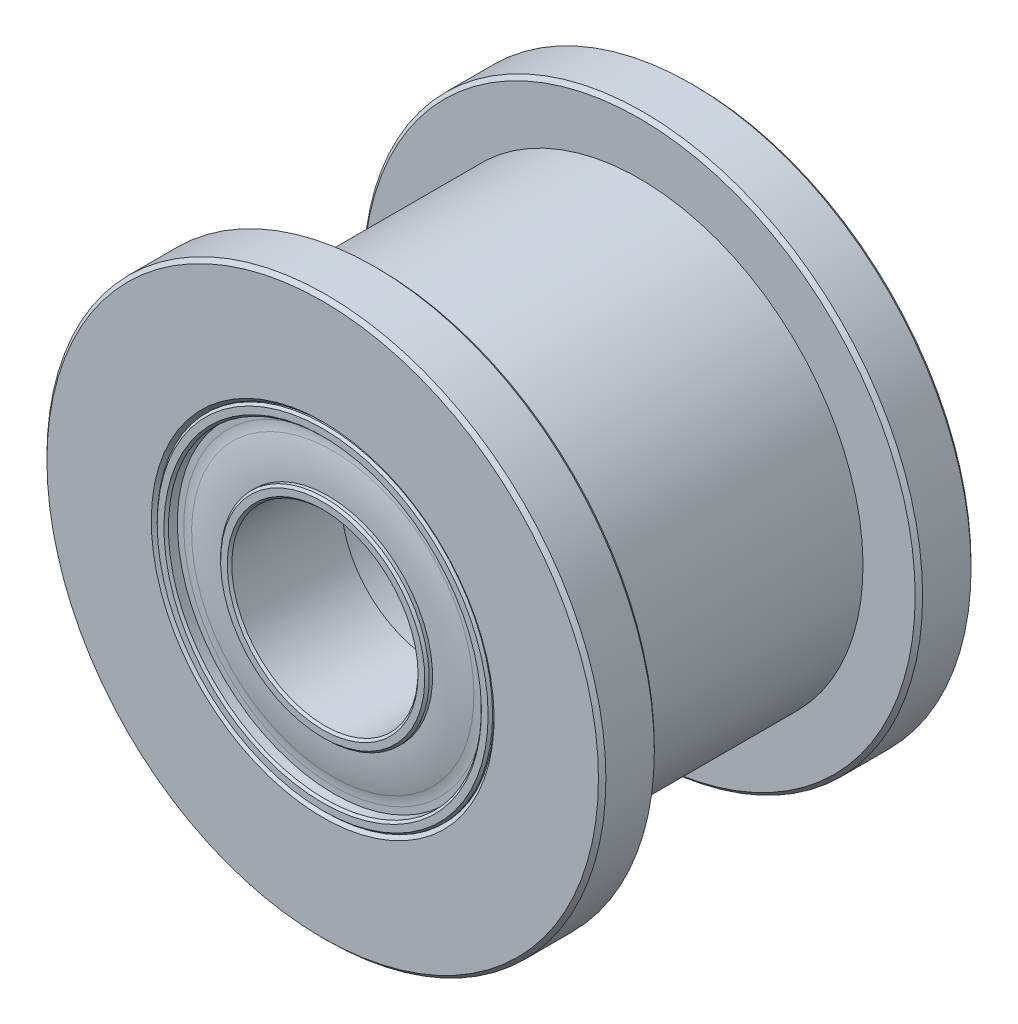
ISO-10303-21;
HEADER;
FILE_DESCRIPTION(('STEP AP214'),'2;1');
FILE_NAME('part.step','',(''),(''),'','','');
FILE_SCHEMA(('AUTOMOTIVE_DESIGN { 1 0 10303 214 1 1 1 1 }'));
ENDSEC;
DATA;
#1=APPLICATION_CONTEXT('core data for automotive mechanical design processes');
#2=APPLICATION_PROTOCOL_DEFINITION('international standard','automotive_design',2000,#1);
#3=PRODUCT_CONTEXT('',#1,'mechanical');
#4=PRODUCT('Part','Part','',(#3));
#5=PRODUCT_RELATED_PRODUCT_CATEGORY('part','',(#4));
#6=PRODUCT_DEFINITION_FORMATION('','',#4);
#7=PRODUCT_DEFINITION_CONTEXT('part definition',#1,'design');
#8=PRODUCT_DEFINITION('design','',#6,#7);
#9=PRODUCT_DEFINITION_SHAPE('','',#8);
#10=(LENGTH_UNIT() NAMED_UNIT(*) SI_UNIT(.MILLI.,.METRE.));
#11=(NAMED_UNIT(*) PLANE_ANGLE_UNIT() SI_UNIT($,.RADIAN.));
#12=(NAMED_UNIT(*) SI_UNIT($,.STERADIAN.) SOLID_ANGLE_UNIT());
#13=UNCERTAINTY_MEASURE_WITH_UNIT(LENGTH_MEASURE(1.E-05),#10,'distance_accuracy_value','');
#14=(GEOMETRIC_REPRESENTATION_CONTEXT(3) GLOBAL_UNCERTAINTY_ASSIGNED_CONTEXT((#13)) GLOBAL_UNIT_ASSIGNED_CONTEXT((#10,
#11,#12)) REPRESENTATION_CONTEXT('',''));
#15=CARTESIAN_POINT('',(0.,0.,0.));
#16=DIRECTION('',(0.,0.,1.));
#17=DIRECTION('',(1.,0.,0.));
#18=AXIS2_PLACEMENT_3D('',#15,#16,#17);
#19=CARTESIAN_POINT('',(0.,7.5,-3.5));
#20=DIRECTION('',(0.,0.,-1.));
#21=DIRECTION('',(0.,1.,0.));
#22=AXIS2_PLACEMENT_3D('',#19,#20,#21);
#23=PLANE('',#22);
#24=CARTESIAN_POINT('',(0.,0.,-3.5));
#25=DIRECTION('',(0.,0.,-1.));
#26=DIRECTION('',(0.,1.,0.));
#27=AXIS2_PLACEMENT_3D('',#24,#25,#26);
#28=CIRCLE('',#27,7.4);
#29=CARTESIAN_POINT('',(0.,7.4,-3.5));
#30=VERTEX_POINT('',#29);
#31=EDGE_CURVE('E70',#30,#30,#28,.F.);
#32=ORIENTED_EDGE('',*,*,#31,.T.);
#33=EDGE_LOOP('',(#32));
#34=FACE_BOUND('',#33,.T.);
#35=CARTESIAN_POINT('',(0.,0.,-3.5));
#36=DIRECTION('',(0.,0.,1.));
#37=DIRECTION('',(0.,-1.,0.));
#38=AXIS2_PLACEMENT_3D('',#35,#36,#37);
#39=CIRCLE('',#38,6.);
#40=CARTESIAN_POINT('',(0.,-6.,-3.5));
#41=VERTEX_POINT('',#40);
#42=EDGE_CURVE('E100',#41,#41,#39,.T.);
#43=ORIENTED_EDGE('',*,*,#42,.F.);
#44=EDGE_LOOP('',(#43));
#45=FACE_BOUND('',#44,.T.);
#46=ADVANCED_FACE('F41',(#34,#45),#23,.F.);
#47=CARTESIAN_POINT('',(0.,0.,5.));
#48=DIRECTION('',(0.,0.,1.));
#49=DIRECTION('',(0.,-1.,0.));
#50=AXIS2_PLACEMENT_3D('',#47,#48,#49);
#51=CYLINDRICAL_SURFACE('',#50,7.5);
#52=CARTESIAN_POINT('',(0.,0.,-4.9));
#53=DIRECTION('',(0.,0.,1.));
#54=DIRECTION('',(0.,-1.,0.));
#55=AXIS2_PLACEMENT_3D('',#52,#53,#54);
#56=CIRCLE('',#55,7.5);
#57=CARTESIAN_POINT('',(0.,-7.5,-4.9));
#58=VERTEX_POINT('',#57);
#59=EDGE_CURVE('E79',#58,#58,#56,.T.);
#60=ORIENTED_EDGE('',*,*,#59,.T.);
#61=EDGE_LOOP('',(#60));
#62=FACE_BOUND('',#61,.T.);
#63=CARTESIAN_POINT('',(0.,0.,-3.6));
#64=DIRECTION('',(0.,0.,-1.));
#65=DIRECTION('',(0.,1.,0.));
#66=AXIS2_PLACEMENT_3D('',#63,#64,#65);
#67=CIRCLE('',#66,7.5);
#68=CARTESIAN_POINT('',(0.,7.5,-3.6));
#69=VERTEX_POINT('',#68);
#70=EDGE_CURVE('E82',#69,#69,#67,.T.);
#71=ORIENTED_EDGE('',*,*,#70,.T.);
#72=EDGE_LOOP('',(#71));
#73=FACE_BOUND('',#72,.T.);
#74=ADVANCED_FACE('F107',(#62,#73),#51,.T.);
#75=CARTESIAN_POINT('',(0.,7.5,-5.));
#76=DIRECTION('',(0.,0.,1.));
#77=DIRECTION('',(0.,-1.,0.));
#78=AXIS2_PLACEMENT_3D('',#75,#76,#77);
#79=PLANE('',#78);
#80=CARTESIAN_POINT('',(0.,0.,-5.));
#81=DIRECTION('',(0.,0.,1.));
#82=DIRECTION('',(0.,-1.,0.));
#83=AXIS2_PLACEMENT_3D('',#80,#81,#82);
#84=CIRCLE('',#83,7.4);
#85=CARTESIAN_POINT('',(0.,-7.4,-5.));
#86=VERTEX_POINT('',#85);
#87=EDGE_CURVE('E73',#86,#86,#84,.F.);
#88=ORIENTED_EDGE('',*,*,#87,.T.);
#89=EDGE_LOOP('',(#88));
#90=FACE_BOUND('',#89,.T.);
#91=CARTESIAN_POINT('',(0.,0.,-5.));
#92=DIRECTION('',(0.,0.,1.));
#93=DIRECTION('',(0.,-1.,0.));
#94=AXIS2_PLACEMENT_3D('',#91,#92,#93);
#95=CIRCLE('',#94,4.6);
#96=CARTESIAN_POINT('',(0.,-4.6,-5.));
#97=VERTEX_POINT('',#96);
#98=EDGE_CURVE('E76',#97,#97,#95,.T.);
#99=ORIENTED_EDGE('',*,*,#98,.T.);
#100=EDGE_LOOP('',(#99));
#101=FACE_BOUND('',#100,.T.);
#102=ADVANCED_FACE('F113',(#90,#101),#79,.F.);
#103=CARTESIAN_POINT('',(0.,0.,5.));
#104=DIRECTION('',(0.,0.,1.));
#105=DIRECTION('',(0.,-1.,0.));
#106=AXIS2_PLACEMENT_3D('',#103,#104,#105);
#107=CYLINDRICAL_SURFACE('',#106,4.5);
#108=CARTESIAN_POINT('',(0.,0.,-4.9));
#109=DIRECTION('',(0.,0.,1.));
#110=DIRECTION('',(0.,-1.,0.));
#111=AXIS2_PLACEMENT_3D('',#108,#109,#110);
#112=CIRCLE('',#111,4.5);
#113=CARTESIAN_POINT('',(0.,-4.5,-4.9));
#114=VERTEX_POINT('',#113);
#115=EDGE_CURVE('E48',#114,#114,#112,.F.);
#116=ORIENTED_EDGE('',*,*,#115,.T.);
#117=EDGE_LOOP('',(#116));
#118=FACE_BOUND('',#117,.T.);
#119=CARTESIAN_POINT('',(0.,0.,-2.));
#120=DIRECTION('',(0.,0.,1.));
#121=DIRECTION('',(0.,-1.,0.));
#122=AXIS2_PLACEMENT_3D('',#119,#120,#121);
#123=CIRCLE('',#122,4.5);
#124=CARTESIAN_POINT('',(0.,-4.5,-2.));
#125=VERTEX_POINT('',#124);
#126=EDGE_CURVE('E85',#125,#125,#123,.T.);
#127=ORIENTED_EDGE('',*,*,#126,.T.);
#128=EDGE_LOOP('',(#127));
#129=FACE_BOUND('',#128,.T.);
#130=ADVANCED_FACE('F144',(#118,#129),#107,.F.);
#131=CARTESIAN_POINT('',(0.,3.5,-2.));
#132=DIRECTION('',(0.,0.,1.));
#133=DIRECTION('',(0.,-1.,0.));
#134=AXIS2_PLACEMENT_3D('',#131,#132,#133);
#135=PLANE('',#134);
#136=ORIENTED_EDGE('',*,*,#126,.F.);
#137=EDGE_LOOP('',(#136));
#138=FACE_BOUND('',#137,.T.);
#139=CARTESIAN_POINT('',(0.,0.,-2.));
#140=DIRECTION('',(0.,0.,1.));
#141=DIRECTION('',(0.,-1.,0.));
#142=AXIS2_PLACEMENT_3D('',#139,#140,#141);
#143=CIRCLE('',#142,3.5);
#144=CARTESIAN_POINT('',(0.,-3.5,-2.));
#145=VERTEX_POINT('',#144);
#146=EDGE_CURVE('E88',#145,#145,#143,.T.);
#147=ORIENTED_EDGE('',*,*,#146,.T.);
#148=EDGE_LOOP('',(#147));
#149=FACE_BOUND('',#148,.T.);
#150=ADVANCED_FACE('F149',(#138,#149),#135,.F.);
#151=CARTESIAN_POINT('',(0.,0.,5.));
#152=DIRECTION('',(0.,0.,1.));
#153=DIRECTION('',(0.,-1.,0.));
#154=AXIS2_PLACEMENT_3D('',#151,#152,#153);
#155=CYLINDRICAL_SURFACE('',#154,3.5);
#156=ORIENTED_EDGE('',*,*,#146,.F.);
#157=EDGE_LOOP('',(#156));
#158=FACE_BOUND('',#157,.T.);
#159=CARTESIAN_POINT('',(0.,0.,2.));
#160=DIRECTION('',(0.,0.,1.));
#161=DIRECTION('',(0.,-1.,0.));
#162=AXIS2_PLACEMENT_3D('',#159,#160,#161);
#163=CIRCLE('',#162,3.5);
#164=CARTESIAN_POINT('',(0.,-3.5,2.));
#165=VERTEX_POINT('',#164);
#166=EDGE_CURVE('E91',#165,#165,#163,.T.);
#167=ORIENTED_EDGE('',*,*,#166,.T.);
#168=EDGE_LOOP('',(#167));
#169=FACE_BOUND('',#168,.T.);
#170=ADVANCED_FACE('F154',(#158,#169),#155,.F.);
#171=CARTESIAN_POINT('',(0.,4.5,2.));
#172=DIRECTION('',(0.,0.,-1.));
#173=DIRECTION('',(0.,1.,0.));
#174=AXIS2_PLACEMENT_3D('',#171,#172,#173);
#175=PLANE('',#174);
#176=ORIENTED_EDGE('',*,*,#166,.F.);
#177=EDGE_LOOP('',(#176));
#178=FACE_BOUND('',#177,.T.);
#179=CARTESIAN_POINT('',(0.,0.,2.));
#180=DIRECTION('',(0.,0.,1.));
#181=DIRECTION('',(0.,-1.,0.));
#182=AXIS2_PLACEMENT_3D('',#179,#180,#181);
#183=CIRCLE('',#182,4.5);
#184=CARTESIAN_POINT('',(0.,-4.5,2.));
#185=VERTEX_POINT('',#184);
#186=EDGE_CURVE('E94',#185,#185,#183,.T.);
#187=ORIENTED_EDGE('',*,*,#186,.T.);
#188=EDGE_LOOP('',(#187));
#189=FACE_BOUND('',#188,.T.);
#190=ADVANCED_FACE('F158',(#178,#189),#175,.F.);
#191=CARTESIAN_POINT('',(0.,0.,5.));
#192=DIRECTION('',(0.,0.,1.));
#193=DIRECTION('',(0.,-1.,0.));
#194=AXIS2_PLACEMENT_3D('',#191,#192,#193);
#195=CYLINDRICAL_SURFACE('',#194,4.5);
#196=CARTESIAN_POINT('',(0.,0.,4.9));
#197=DIRECTION('',(0.,0.,-1.));
#198=DIRECTION('',(0.,1.,0.));
#199=AXIS2_PLACEMENT_3D('',#196,#197,#198);
#200=CIRCLE('',#199,4.5);
#201=CARTESIAN_POINT('',(0.,4.5,4.9));
#202=VERTEX_POINT('',#201);
#203=EDGE_CURVE('E11',#202,#202,#200,.F.);
#204=ORIENTED_EDGE('',*,*,#203,.T.);
#205=EDGE_LOOP('',(#204));
#206=FACE_BOUND('',#205,.T.);
#207=ORIENTED_EDGE('',*,*,#186,.F.);
#208=EDGE_LOOP('',(#207));
#209=FACE_BOUND('',#208,.T.);
#210=ADVANCED_FACE('F162',(#206,#209),#195,.F.);
#211=CARTESIAN_POINT('',(0.,7.5,5.));
#212=DIRECTION('',(0.,0.,-1.));
#213=DIRECTION('',(0.,1.,0.));
#214=AXIS2_PLACEMENT_3D('',#211,#212,#213);
#215=PLANE('',#214);
#216=CARTESIAN_POINT('',(0.,0.,5.));
#217=DIRECTION('',(0.,0.,-1.));
#218=DIRECTION('',(0.,1.,0.));
#219=AXIS2_PLACEMENT_3D('',#216,#217,#218);
#220=CIRCLE('',#219,7.4);
#221=CARTESIAN_POINT('',(0.,7.4,5.));
#222=VERTEX_POINT('',#221);
#223=EDGE_CURVE('E52',#222,#222,#220,.F.);
#224=ORIENTED_EDGE('',*,*,#223,.T.);
#225=EDGE_LOOP('',(#224));
#226=FACE_BOUND('',#225,.T.);
#227=CARTESIAN_POINT('',(0.,0.,5.));
#228=DIRECTION('',(0.,0.,-1.));
#229=DIRECTION('',(0.,1.,0.));
#230=AXIS2_PLACEMENT_3D('',#227,#228,#229);
#231=CIRCLE('',#230,4.6);
#232=CARTESIAN_POINT('',(0.,4.6,5.));
#233=VERTEX_POINT('',#232);
#234=EDGE_CURVE('E56',#233,#233,#231,.T.);
#235=ORIENTED_EDGE('',*,*,#234,.T.);
#236=EDGE_LOOP('',(#235));
#237=FACE_BOUND('',#236,.T.);
#238=ADVANCED_FACE('F166',(#226,#237),#215,.F.);
#239=CARTESIAN_POINT('',(0.,0.,5.));
#240=DIRECTION('',(0.,0.,1.));
#241=DIRECTION('',(0.,-1.,0.));
#242=AXIS2_PLACEMENT_3D('',#239,#240,#241);
#243=CYLINDRICAL_SURFACE('',#242,7.5);
#244=CARTESIAN_POINT('',(0.,0.,3.6));
#245=DIRECTION('',(0.,0.,1.));
#246=DIRECTION('',(0.,-1.,0.));
#247=AXIS2_PLACEMENT_3D('',#244,#245,#246);
#248=CIRCLE('',#247,7.5);
#249=CARTESIAN_POINT('',(0.,-7.5,3.6));
#250=VERTEX_POINT('',#249);
#251=EDGE_CURVE('E64',#250,#250,#248,.T.);
#252=ORIENTED_EDGE('',*,*,#251,.T.);
#253=EDGE_LOOP('',(#252));
#254=FACE_BOUND('',#253,.T.);
#255=CARTESIAN_POINT('',(0.,0.,4.9));
#256=DIRECTION('',(0.,0.,-1.));
#257=DIRECTION('',(0.,1.,0.));
#258=AXIS2_PLACEMENT_3D('',#255,#256,#257);
#259=CIRCLE('',#258,7.5);
#260=CARTESIAN_POINT('',(0.,7.5,4.9));
#261=VERTEX_POINT('',#260);
#262=EDGE_CURVE('E67',#261,#261,#259,.T.);
#263=ORIENTED_EDGE('',*,*,#262,.T.);
#264=EDGE_LOOP('',(#263));
#265=FACE_BOUND('',#264,.T.);
#266=ADVANCED_FACE('F169',(#254,#265),#243,.T.);
#267=CARTESIAN_POINT('',(0.,7.5,3.5));
#268=DIRECTION('',(0.,0.,1.));
#269=DIRECTION('',(0.,-1.,0.));
#270=AXIS2_PLACEMENT_3D('',#267,#268,#269);
#271=PLANE('',#270);
#272=CARTESIAN_POINT('',(0.,0.,3.5));
#273=DIRECTION('',(0.,0.,1.));
#274=DIRECTION('',(0.,-1.,0.));
#275=AXIS2_PLACEMENT_3D('',#272,#273,#274);
#276=CIRCLE('',#275,7.4);
#277=CARTESIAN_POINT('',(0.,-7.4,3.5));
#278=VERTEX_POINT('',#277);
#279=EDGE_CURVE('E61',#278,#278,#276,.F.);
#280=ORIENTED_EDGE('',*,*,#279,.T.);
#281=EDGE_LOOP('',(#280));
#282=FACE_BOUND('',#281,.T.);
#283=CARTESIAN_POINT('',(0.,0.,3.5));
#284=DIRECTION('',(0.,0.,1.));
#285=DIRECTION('',(0.,-1.,0.));
#286=AXIS2_PLACEMENT_3D('',#283,#284,#285);
#287=CIRCLE('',#286,6.);
#288=CARTESIAN_POINT('',(0.,-6.,3.5));
#289=VERTEX_POINT('',#288);
#290=EDGE_CURVE('E97',#289,#289,#287,.T.);
#291=ORIENTED_EDGE('',*,*,#290,.T.);
#292=EDGE_LOOP('',(#291));
#293=FACE_BOUND('',#292,.T.);
#294=ADVANCED_FACE('F173',(#282,#293),#271,.F.);
#295=CARTESIAN_POINT('',(0.,0.,5.));
#296=DIRECTION('',(0.,0.,1.));
#297=DIRECTION('',(0.,-1.,0.));
#298=AXIS2_PLACEMENT_3D('',#295,#296,#297);
#299=CYLINDRICAL_SURFACE('',#298,6.);
#300=ORIENTED_EDGE('',*,*,#290,.F.);
#301=EDGE_LOOP('',(#300));
#302=FACE_BOUND('',#301,.T.);
#303=ORIENTED_EDGE('',*,*,#42,.T.);
#304=EDGE_LOOP('',(#303));
#305=FACE_BOUND('',#304,.T.);
#306=ADVANCED_FACE('F104',(#302,#305),#299,.T.);
#307=CARTESIAN_POINT('',(0.,0.,-4.9));
#308=DIRECTION('',(0.,0.,1.));
#309=DIRECTION('',(0.,-1.,0.));
#310=AXIS2_PLACEMENT_3D('',#307,#308,#309);
#311=CONICAL_SURFACE('',#310,7.5,0.785398163397448);
#312=ORIENTED_EDGE('',*,*,#87,.F.);
#313=EDGE_LOOP('',(#312));
#314=FACE_BOUND('',#313,.T.);
#315=ORIENTED_EDGE('',*,*,#59,.F.);
#316=EDGE_LOOP('',(#315));
#317=FACE_BOUND('',#316,.T.);
#318=ADVANCED_FACE('F118',(#314,#317),#311,.T.);
#319=CARTESIAN_POINT('',(0.,0.,-3.5));
#320=DIRECTION('',(0.,0.,-1.));
#321=DIRECTION('',(0.,1.,0.));
#322=AXIS2_PLACEMENT_3D('',#319,#320,#321);
#323=CONICAL_SURFACE('',#322,7.4,0.785398163397457);
#324=ORIENTED_EDGE('',*,*,#70,.F.);
#325=EDGE_LOOP('',(#324));
#326=FACE_BOUND('',#325,.T.);
#327=ORIENTED_EDGE('',*,*,#31,.F.);
#328=EDGE_LOOP('',(#327));
#329=FACE_BOUND('',#328,.T.);
#330=ADVANCED_FACE('F121',(#326,#329),#323,.T.);
#331=CARTESIAN_POINT('',(0.,0.,3.6));
#332=DIRECTION('',(0.,0.,1.));
#333=DIRECTION('',(0.,-1.,0.));
#334=AXIS2_PLACEMENT_3D('',#331,#332,#333);
#335=CONICAL_SURFACE('',#334,7.5,0.785398163397453);
#336=ORIENTED_EDGE('',*,*,#279,.F.);
#337=EDGE_LOOP('',(#336));
#338=FACE_BOUND('',#337,.T.);
#339=ORIENTED_EDGE('',*,*,#251,.F.);
#340=EDGE_LOOP('',(#339));
#341=FACE_BOUND('',#340,.T.);
#342=ADVANCED_FACE('F125',(#338,#341),#335,.T.);
#343=CARTESIAN_POINT('',(0.,0.,5.));
#344=DIRECTION('',(0.,0.,-1.));
#345=DIRECTION('',(0.,1.,0.));
#346=AXIS2_PLACEMENT_3D('',#343,#344,#345);
#347=CONICAL_SURFACE('',#346,7.4,0.785398163397448);
#348=ORIENTED_EDGE('',*,*,#262,.F.);
#349=EDGE_LOOP('',(#348));
#350=FACE_BOUND('',#349,.T.);
#351=ORIENTED_EDGE('',*,*,#223,.F.);
#352=EDGE_LOOP('',(#351));
#353=FACE_BOUND('',#352,.T.);
#354=ADVANCED_FACE('F129',(#350,#353),#347,.T.);
#355=CARTESIAN_POINT('',(0.,0.,-5.));
#356=DIRECTION('',(0.,0.,-1.));
#357=DIRECTION('',(0.,1.,0.));
#358=AXIS2_PLACEMENT_3D('',#355,#356,#357);
#359=CONICAL_SURFACE('',#358,4.6,0.785398163397435);
#360=ORIENTED_EDGE('',*,*,#115,.F.);
#361=EDGE_LOOP('',(#360));
#362=FACE_BOUND('',#361,.T.);
#363=ORIENTED_EDGE('',*,*,#98,.F.);
#364=EDGE_LOOP('',(#363));
#365=FACE_BOUND('',#364,.T.);
#366=ADVANCED_FACE('F132',(#362,#365),#359,.F.);
#367=CARTESIAN_POINT('',(0.,0.,4.9));
#368=DIRECTION('',(0.,0.,1.));
#369=DIRECTION('',(0.,-1.,0.));
#370=AXIS2_PLACEMENT_3D('',#367,#368,#369);
#371=CONICAL_SURFACE('',#370,4.5,0.78539816339744);
#372=ORIENTED_EDGE('',*,*,#234,.F.);
#373=EDGE_LOOP('',(#372));
#374=FACE_BOUND('',#373,.T.);
#375=ORIENTED_EDGE('',*,*,#203,.F.);
#376=EDGE_LOOP('',(#375));
#377=FACE_BOUND('',#376,.T.);
#378=ADVANCED_FACE('F43',(#374,#377),#371,.F.);
#379=CLOSED_SHELL('',(#46,#74,#102,#130,#150,#170,#190,#210,#238,#266,#294,#306,#318,#330,#342,
#354,#366,#378));
#380=MANIFOLD_SOLID_BREP('B2',#379);
#381=CARTESIAN_POINT('',(0.,2.5,5.));
#382=DIRECTION('',(0.,0.,-1.));
#383=DIRECTION('',(0.,-1.,0.));
#384=AXIS2_PLACEMENT_3D('',#381,#382,#383);
#385=PLANE('',#384);
#386=CARTESIAN_POINT('',(0.,0.,5.));
#387=DIRECTION('',(0.,0.,1.));
#388=DIRECTION('',(0.,-1.,0.));
#389=AXIS2_PLACEMENT_3D('',#386,#387,#388);
#390=CIRCLE('',#389,2.74);
#391=CARTESIAN_POINT('',(0.,-2.74,5.));
#392=VERTEX_POINT('',#391);
#393=EDGE_CURVE('E348',#392,#392,#390,.F.);
#394=ORIENTED_EDGE('',*,*,#393,.F.);
#395=EDGE_LOOP('',(#394));
#396=FACE_BOUND('',#395,.T.);
#397=CARTESIAN_POINT('',(0.,0.,5.));
#398=DIRECTION('',(0.,0.,1.));
#399=DIRECTION('',(0.,-1.,0.));
#400=AXIS2_PLACEMENT_3D('',#397,#398,#399);
#401=CIRCLE('',#400,2.56);
#402=CARTESIAN_POINT('',(0.,-2.56,5.));
#403=VERTEX_POINT('',#402);
#404=EDGE_CURVE('E351',#403,#403,#401,.T.);
#405=ORIENTED_EDGE('',*,*,#404,.F.);
#406=EDGE_LOOP('',(#405));
#407=FACE_BOUND('',#406,.T.);
#408=ADVANCED_FACE('F319',(#396,#407),#385,.F.);
#409=CARTESIAN_POINT('',(0.,0.,-5.));
#410=DIRECTION('',(0.,0.,-1.));
#411=DIRECTION('',(0.,-1.,0.));
#412=AXIS2_PLACEMENT_3D('',#409,#410,#411);
#413=CYLINDRICAL_SURFACE('',#412,2.5);
#414=CARTESIAN_POINT('',(0.,0.,4.94));
#415=DIRECTION('',(0.,0.,1.));
#416=DIRECTION('',(0.,-1.,0.));
#417=AXIS2_PLACEMENT_3D('',#414,#415,#416);
#418=CIRCLE('',#417,2.5);
#419=CARTESIAN_POINT('',(0.,-2.5,4.94));
#420=VERTEX_POINT('',#419);
#421=EDGE_CURVE('E345',#420,#420,#418,.F.);
#422=ORIENTED_EDGE('',*,*,#421,.F.);
#423=EDGE_LOOP('',(#422));
#424=FACE_BOUND('',#423,.T.);
#425=CARTESIAN_POINT('',(0.,0.,2.));
#426=DIRECTION('',(0.,0.,1.));
#427=DIRECTION('',(0.,-1.,0.));
#428=AXIS2_PLACEMENT_3D('',#425,#426,#427);
#429=CIRCLE('',#428,2.5);
#430=CARTESIAN_POINT('',(0.,-2.5,2.));
#431=VERTEX_POINT('',#430);
#432=EDGE_CURVE('E357',#431,#431,#429,.T.);
#433=ORIENTED_EDGE('',*,*,#432,.F.);
#434=EDGE_LOOP('',(#433));
#435=FACE_BOUND('',#434,.T.);
#436=ADVANCED_FACE('F388',(#424,#435),#413,.F.);
#437=CARTESIAN_POINT('',(0.,4.5,2.));
#438=DIRECTION('',(0.,0.,1.));
#439=DIRECTION('',(0.,1.,0.));
#440=AXIS2_PLACEMENT_3D('',#437,#438,#439);
#441=PLANE('',#440);
#442=ORIENTED_EDGE('',*,*,#432,.T.);
#443=EDGE_LOOP('',(#442));
#444=FACE_BOUND('',#443,.T.);
#445=CARTESIAN_POINT('',(0.,0.,2.));
#446=DIRECTION('',(0.,0.,1.));
#447=DIRECTION('',(0.,-1.,0.));
#448=AXIS2_PLACEMENT_3D('',#445,#446,#447);
#449=CIRCLE('',#448,4.5);
#450=CARTESIAN_POINT('',(0.,-4.5,2.));
#451=VERTEX_POINT('',#450);
#452=EDGE_CURVE('E360',#451,#451,#449,.T.);
#453=ORIENTED_EDGE('',*,*,#452,.F.);
#454=EDGE_LOOP('',(#453));
#455=FACE_BOUND('',#454,.T.);
#456=ADVANCED_FACE('F394',(#444,#455),#441,.F.);
#457=CARTESIAN_POINT('',(0.,0.,-5.));
#458=DIRECTION('',(0.,0.,-1.));
#459=DIRECTION('',(0.,-1.,0.));
#460=AXIS2_PLACEMENT_3D('',#457,#458,#459);
#461=CYLINDRICAL_SURFACE('',#460,4.5);
#462=CARTESIAN_POINT('',(0.,0.,4.94));
#463=DIRECTION('',(0.,0.,1.));
#464=DIRECTION('',(0.,-1.,0.));
#465=AXIS2_PLACEMENT_3D('',#462,#463,#464);
#466=CIRCLE('',#465,4.5);
#467=CARTESIAN_POINT('',(0.,-4.5,4.94));
#468=VERTEX_POINT('',#467);
#469=EDGE_CURVE('E330',#468,#468,#466,.T.);
#470=ORIENTED_EDGE('',*,*,#469,.F.);
#471=EDGE_LOOP('',(#470));
#472=FACE_BOUND('',#471,.T.);
#473=ORIENTED_EDGE('',*,*,#452,.T.);
#474=EDGE_LOOP('',(#473));
#475=FACE_BOUND('',#474,.T.);
#476=ADVANCED_FACE('F421',(#472,#475),#461,.T.);
#477=CARTESIAN_POINT('',(0.,4.5,5.));
#478=DIRECTION('',(0.,0.,-1.));
#479=DIRECTION('',(0.,-1.,0.));
#480=AXIS2_PLACEMENT_3D('',#477,#478,#479);
#481=PLANE('',#480);
#482=CARTESIAN_POINT('',(0.,0.,5.));
#483=DIRECTION('',(0.,0.,1.));
#484=DIRECTION('',(0.,-1.,0.));
#485=AXIS2_PLACEMENT_3D('',#482,#483,#484);
#486=CIRCLE('',#485,4.26);
#487=CARTESIAN_POINT('',(0.,-4.26,5.));
#488=VERTEX_POINT('',#487);
#489=EDGE_CURVE('E339',#488,#488,#486,.T.);
#490=ORIENTED_EDGE('',*,*,#489,.F.);
#491=EDGE_LOOP('',(#490));
#492=FACE_BOUND('',#491,.T.);
#493=CARTESIAN_POINT('',(0.,0.,5.));
#494=DIRECTION('',(0.,0.,1.));
#495=DIRECTION('',(0.,-1.,0.));
#496=AXIS2_PLACEMENT_3D('',#493,#494,#495);
#497=CIRCLE('',#496,4.44);
#498=CARTESIAN_POINT('',(0.,-4.44,5.));
#499=VERTEX_POINT('',#498);
#500=EDGE_CURVE('E342',#499,#499,#497,.F.);
#501=ORIENTED_EDGE('',*,*,#500,.F.);
#502=EDGE_LOOP('',(#501));
#503=FACE_BOUND('',#502,.T.);
#504=ADVANCED_FACE('F424',(#492,#503),#481,.F.);
#505=CARTESIAN_POINT('',(0.,0.,-5.));
#506=DIRECTION('',(0.,0.,-1.));
#507=DIRECTION('',(0.,-1.,0.));
#508=AXIS2_PLACEMENT_3D('',#505,#506,#507);
#509=CYLINDRICAL_SURFACE('',#508,4.2);
#510=CARTESIAN_POINT('',(0.,0.,4.94));
#511=DIRECTION('',(0.,0.,1.));
#512=DIRECTION('',(0.,-1.,0.));
#513=AXIS2_PLACEMENT_3D('',#510,#511,#512);
#514=CIRCLE('',#513,4.2);
#515=CARTESIAN_POINT('',(0.,-4.2,4.94));
#516=VERTEX_POINT('',#515);
#517=EDGE_CURVE('E334',#516,#516,#514,.F.);
#518=ORIENTED_EDGE('',*,*,#517,.F.);
#519=EDGE_LOOP('',(#518));
#520=FACE_BOUND('',#519,.T.);
#521=CARTESIAN_POINT('',(0.,0.,4.7));
#522=DIRECTION('',(0.,0.,1.));
#523=DIRECTION('',(0.,-1.,0.));
#524=AXIS2_PLACEMENT_3D('',#521,#522,#523);
#525=CIRCLE('',#524,4.2);
#526=CARTESIAN_POINT('',(0.,-4.2,4.7));
#527=VERTEX_POINT('',#526);
#528=EDGE_CURVE('E363',#527,#527,#525,.T.);
#529=ORIENTED_EDGE('',*,*,#528,.F.);
#530=EDGE_LOOP('',(#529));
#531=FACE_BOUND('',#530,.T.);
#532=ADVANCED_FACE('F384',(#520,#531),#509,.F.);
#533=CARTESIAN_POINT('',(0.,3.9,4.7));
#534=DIRECTION('',(0.,0.,-1.));
#535=DIRECTION('',(0.,-1.,0.));
#536=AXIS2_PLACEMENT_3D('',#533,#534,#535);
#537=PLANE('',#536);
#538=CARTESIAN_POINT('',(0.,0.,4.7));
#539=DIRECTION('',(0.,0.,1.));
#540=DIRECTION('',(0.,-1.,0.));
#541=AXIS2_PLACEMENT_3D('',#538,#539,#540);
#542=CIRCLE('',#541,4.02882057274445);
#543=CARTESIAN_POINT('',(0.,-4.02882057274445,4.7));
#544=VERTEX_POINT('',#543);
#545=EDGE_CURVE('E326',#544,#544,#542,.T.);
#546=ORIENTED_EDGE('',*,*,#545,.F.);
#547=EDGE_LOOP('',(#546));
#548=FACE_BOUND('',#547,.T.);
#549=ORIENTED_EDGE('',*,*,#528,.T.);
#550=EDGE_LOOP('',(#549));
#551=FACE_BOUND('',#550,.T.);
#552=ADVANCED_FACE('F374',(#548,#551),#537,.F.);
#553=CARTESIAN_POINT('',(0.,0.,0.741666666666619));
#554=DIRECTION('',(0.,0.,-1.));
#555=DIRECTION('',(0.,-1.,0.));
#556=AXIS2_PLACEMENT_3D('',#553,#554,#555);
#557=DEGENERATE_TOROIDAL_SURFACE('',#556,2.8,4.10833333333338,.T.);
#558=CARTESIAN_POINT('',(0.,0.,4.72936378466557));
#559=DIRECTION('',(0.,0.,1.));
#560=DIRECTION('',(0.,-1.,0.));
#561=AXIS2_PLACEMENT_3D('',#558,#559,#560);
#562=CIRCLE('',#561,3.78826842147311);
#563=CARTESIAN_POINT('',(0.,-3.78826842147311,4.72936378466557));
#564=VERTEX_POINT('',#563);
#565=EDGE_CURVE('E40',#564,#564,#562,.F.);
#566=ORIENTED_EDGE('',*,*,#565,.F.);
#567=EDGE_LOOP('',(#566));
#568=FACE_BOUND('',#567,.T.);
#569=CARTESIAN_POINT('',(0.,0.,4.85));
#570=DIRECTION('',(0.,0.,1.));
#571=DIRECTION('',(0.,-1.,0.));
#572=AXIS2_PLACEMENT_3D('',#569,#570,#571);
#573=CIRCLE('',#572,2.8);
#574=CARTESIAN_POINT('',(0.,-2.8,4.85));
#575=VERTEX_POINT('',#574);
#576=EDGE_CURVE('E366',#575,#575,#573,.T.);
#577=ORIENTED_EDGE('',*,*,#576,.F.);
#578=EDGE_LOOP('',(#577));
#579=FACE_BOUND('',#578,.T.);
#580=ADVANCED_FACE('F372',(#568,#579),#557,.T.);
#581=CARTESIAN_POINT('',(0.,0.,-5.));
#582=DIRECTION('',(0.,0.,-1.));
#583=DIRECTION('',(0.,-1.,0.));
#584=AXIS2_PLACEMENT_3D('',#581,#582,#583);
#585=CYLINDRICAL_SURFACE('',#584,2.8);
#586=CARTESIAN_POINT('',(0.,0.,4.94));
#587=DIRECTION('',(0.,0.,1.));
#588=DIRECTION('',(0.,-1.,0.));
#589=AXIS2_PLACEMENT_3D('',#586,#587,#588);
#590=CIRCLE('',#589,2.8);
#591=CARTESIAN_POINT('',(0.,-2.8,4.94));
#592=VERTEX_POINT('',#591);
#593=EDGE_CURVE('E354',#592,#592,#590,.T.);
#594=ORIENTED_EDGE('',*,*,#593,.F.);
#595=EDGE_LOOP('',(#594));
#596=FACE_BOUND('',#595,.T.);
#597=ORIENTED_EDGE('',*,*,#576,.T.);
#598=EDGE_LOOP('',(#597));
#599=FACE_BOUND('',#598,.T.);
#600=ADVANCED_FACE('F370',(#596,#599),#585,.T.);
#601=CARTESIAN_POINT('',(0.,0.,4.94));
#602=DIRECTION('',(0.,0.,-1.));
#603=DIRECTION('',(0.,-1.,0.));
#604=AXIS2_PLACEMENT_3D('',#601,#602,#603);
#605=CONICAL_SURFACE('',#604,2.8,0.785398163397434);
#606=CARTESIAN_POINT('',(0.,-2.74,5.));
#607=CARTESIAN_POINT('',(0.,-2.740625,4.999375));
#608=CARTESIAN_POINT('',(0.,-2.74125,4.99875));
#609=CARTESIAN_POINT('',(0.,-2.7425,4.9975));
#610=CARTESIAN_POINT('',(0.,-2.743125,4.996875));
#611=CARTESIAN_POINT('',(0.,-2.744375,4.995625));
#612=CARTESIAN_POINT('',(0.,-2.745,4.995));
#613=CARTESIAN_POINT('',(0.,-2.74625,4.99375));
#614=CARTESIAN_POINT('',(0.,-2.746875,4.993125));
#615=CARTESIAN_POINT('',(0.,-2.748125,4.991875));
#616=CARTESIAN_POINT('',(0.,-2.74875,4.99125));
#617=CARTESIAN_POINT('',(0.,-2.75,4.99));
#618=CARTESIAN_POINT('',(0.,-2.750625,4.989375));
#619=CARTESIAN_POINT('',(0.,-2.751875,4.988125));
#620=CARTESIAN_POINT('',(0.,-2.7525,4.9875));
#621=CARTESIAN_POINT('',(0.,-2.75375,4.98625));
#622=CARTESIAN_POINT('',(0.,-2.754375,4.985625));
#623=CARTESIAN_POINT('',(0.,-2.755625,4.984375));
#624=CARTESIAN_POINT('',(0.,-2.75625,4.98375));
#625=CARTESIAN_POINT('',(0.,-2.7575,4.9825));
#626=CARTESIAN_POINT('',(0.,-2.758125,4.981875));
#627=CARTESIAN_POINT('',(0.,-2.759375,4.980625));
#628=CARTESIAN_POINT('',(0.,-2.76,4.98));
#629=CARTESIAN_POINT('',(0.,-2.76125,4.97875));
#630=CARTESIAN_POINT('',(0.,-2.761875,4.978125));
#631=CARTESIAN_POINT('',(0.,-2.763125,4.976875));
#632=CARTESIAN_POINT('',(0.,-2.76375,4.97625));
#633=CARTESIAN_POINT('',(0.,-2.765,4.975));
#634=CARTESIAN_POINT('',(0.,-2.765625,4.974375));
#635=CARTESIAN_POINT('',(0.,-2.766875,4.973125));
#636=CARTESIAN_POINT('',(0.,-2.7675,4.9725));
#637=CARTESIAN_POINT('',(0.,-2.76875,4.97125));
#638=CARTESIAN_POINT('',(0.,-2.769375,4.970625));
#639=CARTESIAN_POINT('',(0.,-2.770625,4.969375));
#640=CARTESIAN_POINT('',(0.,-2.77125,4.96875));
#641=CARTESIAN_POINT('',(0.,-2.7725,4.9675));
#642=CARTESIAN_POINT('',(0.,-2.773125,4.966875));
#643=CARTESIAN_POINT('',(0.,-2.774375,4.965625));
#644=CARTESIAN_POINT('',(0.,-2.775,4.965));
#645=CARTESIAN_POINT('',(0.,-2.77625,4.96375));
#646=CARTESIAN_POINT('',(0.,-2.776875,4.963125));
#647=CARTESIAN_POINT('',(0.,-2.778125,4.961875));
#648=CARTESIAN_POINT('',(0.,-2.77875,4.96125));
#649=CARTESIAN_POINT('',(0.,-2.78,4.96));
#650=CARTESIAN_POINT('',(0.,-2.780625,4.959375));
#651=CARTESIAN_POINT('',(0.,-2.781875,4.958125));
#652=CARTESIAN_POINT('',(0.,-2.7825,4.9575));
#653=CARTESIAN_POINT('',(0.,-2.78375,4.95625));
#654=CARTESIAN_POINT('',(0.,-2.784375,4.955625));
#655=CARTESIAN_POINT('',(0.,-2.785625,4.954375));
#656=CARTESIAN_POINT('',(0.,-2.78625,4.95375));
#657=CARTESIAN_POINT('',(0.,-2.7875,4.9525));
#658=CARTESIAN_POINT('',(0.,-2.788125,4.951875));
#659=CARTESIAN_POINT('',(0.,-2.789375,4.950625));
#660=CARTESIAN_POINT('',(0.,-2.79,4.95));
#661=CARTESIAN_POINT('',(0.,-2.79125,4.94875));
#662=CARTESIAN_POINT('',(0.,-2.791875,4.948125));
#663=CARTESIAN_POINT('',(0.,-2.793125,4.946875));
#664=CARTESIAN_POINT('',(0.,-2.79375,4.94625));
#665=CARTESIAN_POINT('',(0.,-2.795,4.945));
#666=CARTESIAN_POINT('',(0.,-2.795625,4.944375));
#667=CARTESIAN_POINT('',(0.,-2.796875,4.943125));
#668=CARTESIAN_POINT('',(0.,-2.7975,4.9425));
#669=CARTESIAN_POINT('',(0.,-2.79875,4.94125));
#670=CARTESIAN_POINT('',(0.,-2.799375,4.940625));
#671=CARTESIAN_POINT('',(0.,-2.8,4.94));
#672=B_SPLINE_CURVE_WITH_KNOTS('',3,(#606,#607,#608,#609,#610,#611,#612,#613,#614,#615,#616,
#617,#618,#619,#620,#621,#622,#623,#624,#625,#626,#627,#628,#629,#630,#631,#632,#633,#634,#635,
#636,#637,#638,#639,#640,#641,#642,#643,#644,#645,#646,#647,#648,#649,#650,#651,#652,#653,#654,
#655,#656,#657,#658,#659,#660,#661,#662,#663,#664,#665,#666,#667,#668,#669,#670,#671),
.UNSPECIFIED.,.F.,.F.,(4,2,2,2,2,2,2,2,2,2,2,2,2,2,2,2,2,2,2,2,2,2,2,2,2,2,2,2,2,2,2,2,4),(0.,
0.00265165042944975,0.0053033008588992,0.00795495128834895,0.0106066017177984,
0.0132582521472481,0.0159099025766979,0.0185615530061473,0.0212132034355965,0.0238648538650462,
0.0265165042944957,0.0291681547239454,0.0318198051533949,0.0344714555828446,0.0371231060122944,
0.0397747564417438,0.042426406871193,0.0450780573006427,0.0477297077300922,0.0503813581595419,
0.0530330085889914,0.0556846590184411,0.0583363094478909,0.0609879598773403,0.0636396103067901,
0.0662912607362392,0.0689429111656886,0.0715945615951384,0.0742462120245881,0.0768978624540376,
0.0795495128834873,0.0822011633129368,0.0848528137423859),.UNSPECIFIED.);
#673=EDGE_CURVE('BSEAM381',#392,#592,#672,.T.);
#674=ORIENTED_EDGE('',*,*,#393,.T.);
#675=ORIENTED_EDGE('',*,*,#593,.T.);
#676=ORIENTED_EDGE('',*,*,#673,.T.);
#677=ORIENTED_EDGE('',*,*,#673,.F.);
#678=EDGE_LOOP('',(#674,#676,#675,#677));
#679=FACE_BOUND('',#678,.T.);
#680=ADVANCED_FACE('F381',(#679),#605,.T.);
#681=CARTESIAN_POINT('',(0.,0.,5.));
#682=DIRECTION('',(0.,0.,1.));
#683=DIRECTION('',(0.,1.,0.));
#684=AXIS2_PLACEMENT_3D('',#681,#682,#683);
#685=CONICAL_SURFACE('',#684,2.56,0.785398163397445);
#686=ORIENTED_EDGE('',*,*,#421,.T.);
#687=EDGE_LOOP('',(#686));
#688=FACE_BOUND('',#687,.T.);
#689=ORIENTED_EDGE('',*,*,#404,.T.);
#690=EDGE_LOOP('',(#689));
#691=FACE_BOUND('',#690,.T.);
#692=ADVANCED_FACE('F403',(#688,#691),#685,.F.);
#693=CARTESIAN_POINT('',(0.,0.,5.));
#694=DIRECTION('',(0.,0.,1.));
#695=DIRECTION('',(0.,1.,0.));
#696=AXIS2_PLACEMENT_3D('',#693,#694,#695);
#697=CONICAL_SURFACE('',#696,4.26,0.785398163397434);
#698=ORIENTED_EDGE('',*,*,#517,.T.);
#699=EDGE_LOOP('',(#698));
#700=FACE_BOUND('',#699,.T.);
#701=ORIENTED_EDGE('',*,*,#489,.T.);
#702=EDGE_LOOP('',(#701));
#703=FACE_BOUND('',#702,.T.);
#704=ADVANCED_FACE('F407',(#700,#703),#697,.F.);
#705=CARTESIAN_POINT('',(0.,0.,4.94));
#706=DIRECTION('',(0.,0.,-1.));
#707=DIRECTION('',(0.,-1.,0.));
#708=AXIS2_PLACEMENT_3D('',#705,#706,#707);
#709=CONICAL_SURFACE('',#708,4.5,0.785398163397441);
#710=ORIENTED_EDGE('',*,*,#500,.T.);
#711=EDGE_LOOP('',(#710));
#712=FACE_BOUND('',#711,.T.);
#713=ORIENTED_EDGE('',*,*,#469,.T.);
#714=EDGE_LOOP('',(#713));
#715=FACE_BOUND('',#714,.T.);
#716=ADVANCED_FACE('F410',(#712,#715),#709,.T.);
#717=CARTESIAN_POINT('',(0.,0.,5.7));
#718=DIRECTION('',(0.,0.,-1.));
#719=DIRECTION('',(0.,-1.,0.));
#720=AXIS2_PLACEMENT_3D('',#717,#718,#719);
#721=TOROIDAL_SURFACE('',#720,4.02882057274445,1.);
#722=ORIENTED_EDGE('',*,*,#565,.T.);
#723=EDGE_LOOP('',(#722));
#724=FACE_BOUND('',#723,.T.);
#725=ORIENTED_EDGE('',*,*,#545,.T.);
#726=EDGE_LOOP('',(#725));
#727=FACE_BOUND('',#726,.T.);
#728=ADVANCED_FACE('F321',(#724,#727),#721,.F.);
#729=CLOSED_SHELL('',(#408,#436,#456,#476,#504,#532,#552,#580,#600,#680,#692,#704,#716,#728));
#730=MANIFOLD_SOLID_BREP('B6',#729);
#731=CARTESIAN_POINT('',(0.,2.5,-5.));
#732=DIRECTION('',(0.,0.,1.));
#733=DIRECTION('',(0.,-1.,0.));
#734=AXIS2_PLACEMENT_3D('',#731,#732,#733);
#735=PLANE('',#734);
#736=CARTESIAN_POINT('',(0.,0.,-5.));
#737=DIRECTION('',(0.,0.,1.));
#738=DIRECTION('',(0.,-1.,0.));
#739=AXIS2_PLACEMENT_3D('',#736,#737,#738);
#740=CIRCLE('',#739,2.74);
#741=CARTESIAN_POINT('',(0.,-2.74,-5.));
#742=VERTEX_POINT('',#741);
#743=EDGE_CURVE('E598',#742,#742,#740,.F.);
#744=ORIENTED_EDGE('',*,*,#743,.T.);
#745=EDGE_LOOP('',(#744));
#746=FACE_BOUND('',#745,.T.);
#747=CARTESIAN_POINT('',(0.,0.,-5.));
#748=DIRECTION('',(0.,0.,1.));
#749=DIRECTION('',(0.,-1.,0.));
#750=AXIS2_PLACEMENT_3D('',#747,#748,#749);
#751=CIRCLE('',#750,2.56);
#752=CARTESIAN_POINT('',(0.,-2.56,-5.));
#753=VERTEX_POINT('',#752);
#754=EDGE_CURVE('E601',#753,#753,#751,.T.);
#755=ORIENTED_EDGE('',*,*,#754,.T.);
#756=EDGE_LOOP('',(#755));
#757=FACE_BOUND('',#756,.T.);
#758=ADVANCED_FACE('F569',(#746,#757),#735,.F.);
#759=CARTESIAN_POINT('',(0.,0.,5.));
#760=DIRECTION('',(0.,0.,1.));
#761=DIRECTION('',(0.,-1.,0.));
#762=AXIS2_PLACEMENT_3D('',#759,#760,#761);
#763=CYLINDRICAL_SURFACE('',#762,2.5);
#764=CARTESIAN_POINT('',(0.,0.,-4.94));
#765=DIRECTION('',(0.,0.,1.));
#766=DIRECTION('',(0.,-1.,0.));
#767=AXIS2_PLACEMENT_3D('',#764,#765,#766);
#768=CIRCLE('',#767,2.5);
#769=CARTESIAN_POINT('',(0.,-2.5,-4.94));
#770=VERTEX_POINT('',#769);
#771=EDGE_CURVE('E595',#770,#770,#768,.F.);
#772=ORIENTED_EDGE('',*,*,#771,.T.);
#773=EDGE_LOOP('',(#772));
#774=FACE_BOUND('',#773,.T.);
#775=CARTESIAN_POINT('',(0.,0.,-2.));
#776=DIRECTION('',(0.,0.,1.));
#777=DIRECTION('',(0.,-1.,0.));
#778=AXIS2_PLACEMENT_3D('',#775,#776,#777);
#779=CIRCLE('',#778,2.5);
#780=CARTESIAN_POINT('',(0.,-2.5,-2.));
#781=VERTEX_POINT('',#780);
#782=EDGE_CURVE('E607',#781,#781,#779,.T.);
#783=ORIENTED_EDGE('',*,*,#782,.T.);
#784=EDGE_LOOP('',(#783));
#785=FACE_BOUND('',#784,.T.);
#786=ADVANCED_FACE('F637',(#774,#785),#763,.F.);
#787=CARTESIAN_POINT('',(0.,4.5,-2.));
#788=DIRECTION('',(0.,0.,-1.));
#789=DIRECTION('',(0.,1.,0.));
#790=AXIS2_PLACEMENT_3D('',#787,#788,#789);
#791=PLANE('',#790);
#792=ORIENTED_EDGE('',*,*,#782,.F.);
#793=EDGE_LOOP('',(#792));
#794=FACE_BOUND('',#793,.T.);
#795=CARTESIAN_POINT('',(0.,0.,-2.));
#796=DIRECTION('',(0.,0.,1.));
#797=DIRECTION('',(0.,-1.,0.));
#798=AXIS2_PLACEMENT_3D('',#795,#796,#797);
#799=CIRCLE('',#798,4.5);
#800=CARTESIAN_POINT('',(0.,-4.5,-2.));
#801=VERTEX_POINT('',#800);
#802=EDGE_CURVE('E610',#801,#801,#799,.T.);
#803=ORIENTED_EDGE('',*,*,#802,.T.);
#804=EDGE_LOOP('',(#803));
#805=FACE_BOUND('',#804,.T.);
#806=ADVANCED_FACE('F643',(#794,#805),#791,.F.);
#807=CARTESIAN_POINT('',(0.,0.,5.));
#808=DIRECTION('',(0.,0.,1.));
#809=DIRECTION('',(0.,-1.,0.));
#810=AXIS2_PLACEMENT_3D('',#807,#808,#809);
#811=CYLINDRICAL_SURFACE('',#810,4.5);
#812=CARTESIAN_POINT('',(0.,0.,-4.94));
#813=DIRECTION('',(0.,0.,1.));
#814=DIRECTION('',(0.,-1.,0.));
#815=AXIS2_PLACEMENT_3D('',#812,#813,#814);
#816=CIRCLE('',#815,4.5);
#817=CARTESIAN_POINT('',(0.,-4.5,-4.94));
#818=VERTEX_POINT('',#817);
#819=EDGE_CURVE('E580',#818,#818,#816,.T.);
#820=ORIENTED_EDGE('',*,*,#819,.T.);
#821=EDGE_LOOP('',(#820));
#822=FACE_BOUND('',#821,.T.);
#823=ORIENTED_EDGE('',*,*,#802,.F.);
#824=EDGE_LOOP('',(#823));
#825=FACE_BOUND('',#824,.T.);
#826=ADVANCED_FACE('F666',(#822,#825),#811,.T.);
#827=CARTESIAN_POINT('',(0.,4.5,-5.));
#828=DIRECTION('',(0.,0.,1.));
#829=DIRECTION('',(0.,-1.,0.));
#830=AXIS2_PLACEMENT_3D('',#827,#828,#829);
#831=PLANE('',#830);
#832=CARTESIAN_POINT('',(0.,0.,-5.));
#833=DIRECTION('',(0.,0.,1.));
#834=DIRECTION('',(0.,-1.,0.));
#835=AXIS2_PLACEMENT_3D('',#832,#833,#834);
#836=CIRCLE('',#835,4.26);
#837=CARTESIAN_POINT('',(0.,-4.26,-5.));
#838=VERTEX_POINT('',#837);
#839=EDGE_CURVE('E589',#838,#838,#836,.T.);
#840=ORIENTED_EDGE('',*,*,#839,.T.);
#841=EDGE_LOOP('',(#840));
#842=FACE_BOUND('',#841,.T.);
#843=CARTESIAN_POINT('',(0.,0.,-5.));
#844=DIRECTION('',(0.,0.,1.));
#845=DIRECTION('',(0.,-1.,0.));
#846=AXIS2_PLACEMENT_3D('',#843,#844,#845);
#847=CIRCLE('',#846,4.44);
#848=CARTESIAN_POINT('',(0.,-4.44,-5.));
#849=VERTEX_POINT('',#848);
#850=EDGE_CURVE('E592',#849,#849,#847,.F.);
#851=ORIENTED_EDGE('',*,*,#850,.T.);
#852=EDGE_LOOP('',(#851));
#853=FACE_BOUND('',#852,.T.);
#854=ADVANCED_FACE('F669',(#842,#853),#831,.F.);
#855=CARTESIAN_POINT('',(0.,0.,5.));
#856=DIRECTION('',(0.,0.,1.));
#857=DIRECTION('',(0.,-1.,0.));
#858=AXIS2_PLACEMENT_3D('',#855,#856,#857);
#859=CYLINDRICAL_SURFACE('',#858,4.2);
#860=CARTESIAN_POINT('',(0.,0.,-4.94));
#861=DIRECTION('',(0.,0.,1.));
#862=DIRECTION('',(0.,-1.,0.));
#863=AXIS2_PLACEMENT_3D('',#860,#861,#862);
#864=CIRCLE('',#863,4.2);
#865=CARTESIAN_POINT('',(0.,-4.2,-4.94));
#866=VERTEX_POINT('',#865);
#867=EDGE_CURVE('E584',#866,#866,#864,.F.);
#868=ORIENTED_EDGE('',*,*,#867,.T.);
#869=EDGE_LOOP('',(#868));
#870=FACE_BOUND('',#869,.T.);
#871=CARTESIAN_POINT('',(0.,0.,-4.7));
#872=DIRECTION('',(0.,0.,1.));
#873=DIRECTION('',(0.,-1.,0.));
#874=AXIS2_PLACEMENT_3D('',#871,#872,#873);
#875=CIRCLE('',#874,4.2);
#876=CARTESIAN_POINT('',(0.,-4.2,-4.7));
#877=VERTEX_POINT('',#876);
#878=EDGE_CURVE('E613',#877,#877,#875,.T.);
#879=ORIENTED_EDGE('',*,*,#878,.T.);
#880=EDGE_LOOP('',(#879));
#881=FACE_BOUND('',#880,.T.);
#882=ADVANCED_FACE('F681',(#870,#881),#859,.F.);
#883=CARTESIAN_POINT('',(0.,3.9,-4.7));
#884=DIRECTION('',(0.,0.,1.));
#885=DIRECTION('',(0.,-1.,0.));
#886=AXIS2_PLACEMENT_3D('',#883,#884,#885);
#887=PLANE('',#886);
#888=CARTESIAN_POINT('',(0.,0.,-4.7));
#889=DIRECTION('',(0.,0.,1.));
#890=DIRECTION('',(0.,-1.,0.));
#891=AXIS2_PLACEMENT_3D('',#888,#889,#890);
#892=CIRCLE('',#891,4.02882057274445);
#893=CARTESIAN_POINT('',(0.,-4.02882057274445,-4.7));
#894=VERTEX_POINT('',#893);
#895=EDGE_CURVE('E576',#894,#894,#892,.T.);
#896=ORIENTED_EDGE('',*,*,#895,.T.);
#897=EDGE_LOOP('',(#896));
#898=FACE_BOUND('',#897,.T.);
#899=ORIENTED_EDGE('',*,*,#878,.F.);
#900=EDGE_LOOP('',(#899));
#901=FACE_BOUND('',#900,.T.);
#902=ADVANCED_FACE('F634',(#898,#901),#887,.F.);
#903=CARTESIAN_POINT('',(0.,0.,-0.741666666666619));
#904=DIRECTION('',(0.,0.,1.));
#905=DIRECTION('',(0.,-1.,0.));
#906=AXIS2_PLACEMENT_3D('',#903,#904,#905);
#907=DEGENERATE_TOROIDAL_SURFACE('',#906,2.8,4.10833333333338,.T.);
#908=CARTESIAN_POINT('',(0.,0.,-4.72936378466557));
#909=DIRECTION('',(0.,0.,1.));
#910=DIRECTION('',(0.,-1.,0.));
#911=AXIS2_PLACEMENT_3D('',#908,#909,#910);
#912=CIRCLE('',#911,3.78826842147311);
#913=CARTESIAN_POINT('',(0.,-3.78826842147311,-4.72936378466557));
#914=VERTEX_POINT('',#913);
#915=EDGE_CURVE('E318',#914,#914,#912,.F.);
#916=ORIENTED_EDGE('',*,*,#915,.T.);
#917=EDGE_LOOP('',(#916));
#918=FACE_BOUND('',#917,.T.);
#919=CARTESIAN_POINT('',(0.,0.,-4.85));
#920=DIRECTION('',(0.,0.,1.));
#921=DIRECTION('',(0.,-1.,0.));
#922=AXIS2_PLACEMENT_3D('',#919,#920,#921);
#923=CIRCLE('',#922,2.8);
#924=CARTESIAN_POINT('',(0.,-2.8,-4.85));
#925=VERTEX_POINT('',#924);
#926=EDGE_CURVE('E616',#925,#925,#923,.T.);
#927=ORIENTED_EDGE('',*,*,#926,.T.);
#928=EDGE_LOOP('',(#927));
#929=FACE_BOUND('',#928,.T.);
#930=ADVANCED_FACE('F620',(#918,#929),#907,.T.);
#931=CARTESIAN_POINT('',(0.,0.,5.));
#932=DIRECTION('',(0.,0.,1.));
#933=DIRECTION('',(0.,-1.,0.));
#934=AXIS2_PLACEMENT_3D('',#931,#932,#933);
#935=CYLINDRICAL_SURFACE('',#934,2.8);
#936=CARTESIAN_POINT('',(0.,0.,-4.94));
#937=DIRECTION('',(0.,0.,1.));
#938=DIRECTION('',(0.,-1.,0.));
#939=AXIS2_PLACEMENT_3D('',#936,#937,#938);
#940=CIRCLE('',#939,2.8);
#941=CARTESIAN_POINT('',(0.,-2.8,-4.94));
#942=VERTEX_POINT('',#941);
#943=EDGE_CURVE('E604',#942,#942,#940,.T.);
#944=ORIENTED_EDGE('',*,*,#943,.T.);
#945=EDGE_LOOP('',(#944));
#946=FACE_BOUND('',#945,.T.);
#947=ORIENTED_EDGE('',*,*,#926,.F.);
#948=EDGE_LOOP('',(#947));
#949=FACE_BOUND('',#948,.T.);
#950=ADVANCED_FACE('F622',(#946,#949),#935,.T.);
#951=CARTESIAN_POINT('',(0.,0.,-4.94));
#952=DIRECTION('',(0.,0.,1.));
#953=DIRECTION('',(0.,-1.,0.));
#954=AXIS2_PLACEMENT_3D('',#951,#952,#953);
#955=CONICAL_SURFACE('',#954,2.8,0.785398163397434);
#956=CARTESIAN_POINT('',(0.,-2.74,-5.));
#957=CARTESIAN_POINT('',(0.,-2.740625,-4.999375));
#958=CARTESIAN_POINT('',(0.,-2.74125,-4.99875));
#959=CARTESIAN_POINT('',(0.,-2.7425,-4.9975));
#960=CARTESIAN_POINT('',(0.,-2.743125,-4.996875));
#961=CARTESIAN_POINT('',(0.,-2.744375,-4.995625));
#962=CARTESIAN_POINT('',(0.,-2.745,-4.995));
#963=CARTESIAN_POINT('',(0.,-2.74625,-4.99375));
#964=CARTESIAN_POINT('',(0.,-2.746875,-4.993125));
#965=CARTESIAN_POINT('',(0.,-2.748125,-4.991875));
#966=CARTESIAN_POINT('',(0.,-2.74875,-4.99125));
#967=CARTESIAN_POINT('',(0.,-2.75,-4.99));
#968=CARTESIAN_POINT('',(0.,-2.750625,-4.989375));
#969=CARTESIAN_POINT('',(0.,-2.751875,-4.988125));
#970=CARTESIAN_POINT('',(0.,-2.7525,-4.9875));
#971=CARTESIAN_POINT('',(0.,-2.75375,-4.98625));
#972=CARTESIAN_POINT('',(0.,-2.754375,-4.985625));
#973=CARTESIAN_POINT('',(0.,-2.755625,-4.984375));
#974=CARTESIAN_POINT('',(0.,-2.75625,-4.98375));
#975=CARTESIAN_POINT('',(0.,-2.7575,-4.9825));
#976=CARTESIAN_POINT('',(0.,-2.758125,-4.981875));
#977=CARTESIAN_POINT('',(0.,-2.759375,-4.980625));
#978=CARTESIAN_POINT('',(0.,-2.76,-4.98));
#979=CARTESIAN_POINT('',(0.,-2.76125,-4.97875));
#980=CARTESIAN_POINT('',(0.,-2.761875,-4.978125));
#981=CARTESIAN_POINT('',(0.,-2.763125,-4.976875));
#982=CARTESIAN_POINT('',(0.,-2.76375,-4.97625));
#983=CARTESIAN_POINT('',(0.,-2.765,-4.975));
#984=CARTESIAN_POINT('',(0.,-2.765625,-4.974375));
#985=CARTESIAN_POINT('',(0.,-2.766875,-4.973125));
#986=CARTESIAN_POINT('',(0.,-2.7675,-4.9725));
#987=CARTESIAN_POINT('',(0.,-2.76875,-4.97125));
#988=CARTESIAN_POINT('',(0.,-2.769375,-4.970625));
#989=CARTESIAN_POINT('',(0.,-2.770625,-4.969375));
#990=CARTESIAN_POINT('',(0.,-2.77125,-4.96875));
#991=CARTESIAN_POINT('',(0.,-2.7725,-4.9675));
#992=CARTESIAN_POINT('',(0.,-2.773125,-4.966875));
#993=CARTESIAN_POINT('',(0.,-2.774375,-4.965625));
#994=CARTESIAN_POINT('',(0.,-2.775,-4.965));
#995=CARTESIAN_POINT('',(0.,-2.77625,-4.96375));
#996=CARTESIAN_POINT('',(0.,-2.776875,-4.963125));
#997=CARTESIAN_POINT('',(0.,-2.778125,-4.961875));
#998=CARTESIAN_POINT('',(0.,-2.77875,-4.96125));
#999=CARTESIAN_POINT('',(0.,-2.78,-4.96));
#1000=CARTESIAN_POINT('',(0.,-2.780625,-4.959375));
#1001=CARTESIAN_POINT('',(0.,-2.781875,-4.958125));
#1002=CARTESIAN_POINT('',(0.,-2.7825,-4.9575));
#1003=CARTESIAN_POINT('',(0.,-2.78375,-4.95625));
#1004=CARTESIAN_POINT('',(0.,-2.784375,-4.955625));
#1005=CARTESIAN_POINT('',(0.,-2.785625,-4.954375));
#1006=CARTESIAN_POINT('',(0.,-2.78625,-4.95375));
#1007=CARTESIAN_POINT('',(0.,-2.7875,-4.9525));
#1008=CARTESIAN_POINT('',(0.,-2.788125,-4.951875));
#1009=CARTESIAN_POINT('',(0.,-2.789375,-4.950625));
#1010=CARTESIAN_POINT('',(0.,-2.79,-4.95));
#1011=CARTESIAN_POINT('',(0.,-2.79125,-4.94875));
#1012=CARTESIAN_POINT('',(0.,-2.791875,-4.948125));
#1013=CARTESIAN_POINT('',(0.,-2.793125,-4.946875));
#1014=CARTESIAN_POINT('',(0.,-2.79375,-4.94625));
#1015=CARTESIAN_POINT('',(0.,-2.795,-4.945));
#1016=CARTESIAN_POINT('',(0.,-2.795625,-4.944375));
#1017=CARTESIAN_POINT('',(0.,-2.796875,-4.943125));
#1018=CARTESIAN_POINT('',(0.,-2.7975,-4.9425));
#1019=CARTESIAN_POINT('',(0.,-2.79875,-4.94125));
#1020=CARTESIAN_POINT('',(0.,-2.799375,-4.940625));
#1021=CARTESIAN_POINT('',(0.,-2.8,-4.94));
#1022=B_SPLINE_CURVE_WITH_KNOTS('',3,(#956,#957,#958,#959,#960,#961,#962,#963,#964,#965,#966,
#967,#968,#969,#970,#971,#972,#973,#974,#975,#976,#977,#978,#979,#980,#981,#982,#983,#984,#985,
#986,#987,#988,#989,#990,#991,#992,#993,#994,#995,#996,#997,#998,#999,#1000,#1001,#1002,#1003,
#1004,#1005,#1006,#1007,#1008,#1009,#1010,#1011,#1012,#1013,#1014,#1015,#1016,#1017,#1018,#1019,
#1020,#1021),.UNSPECIFIED.,.F.,.F.,(4,2,2,2,2,2,2,2,2,2,2,2,2,2,2,2,2,2,2,2,2,2,2,2,2,2,2,2,2,2,
2,2,4),(0.,0.00265165042944975,0.0053033008588992,0.00795495128834895,0.0106066017177984,
0.0132582521472481,0.0159099025766979,0.0185615530061473,0.0212132034355965,0.0238648538650462,
0.0265165042944957,0.0291681547239454,0.0318198051533949,0.0344714555828446,0.0371231060122944,
0.0397747564417438,0.042426406871193,0.0450780573006427,0.0477297077300922,0.0503813581595419,
0.0530330085889914,0.0556846590184411,0.0583363094478909,0.0609879598773403,0.0636396103067901,
0.0662912607362392,0.0689429111656886,0.0715945615951384,0.0742462120245881,0.0768978624540376,
0.0795495128834873,0.0822011633129368,0.0848528137423859),.UNSPECIFIED.);
#1023=EDGE_CURVE('BSEAM624',#742,#942,#1022,.T.);
#1024=ORIENTED_EDGE('',*,*,#743,.F.);
#1025=ORIENTED_EDGE('',*,*,#943,.F.);
#1026=ORIENTED_EDGE('',*,*,#1023,.T.);
#1027=ORIENTED_EDGE('',*,*,#1023,.F.);
#1028=EDGE_LOOP('',(#1024,#1026,#1025,#1027));
#1029=FACE_BOUND('',#1028,.T.);
#1030=ADVANCED_FACE('F624',(#1029),#955,.T.);
#1031=CARTESIAN_POINT('',(0.,0.,-5.));
#1032=DIRECTION('',(0.,0.,-1.));
#1033=DIRECTION('',(0.,1.,0.));
#1034=AXIS2_PLACEMENT_3D('',#1031,#1032,#1033);
#1035=CONICAL_SURFACE('',#1034,2.56,0.785398163397445);
#1036=ORIENTED_EDGE('',*,*,#771,.F.);
#1037=EDGE_LOOP('',(#1036));
#1038=FACE_BOUND('',#1037,.T.);
#1039=ORIENTED_EDGE('',*,*,#754,.F.);
#1040=EDGE_LOOP('',(#1039));
#1041=FACE_BOUND('',#1040,.T.);
#1042=ADVANCED_FACE('F631',(#1038,#1041),#1035,.F.);
#1043=CARTESIAN_POINT('',(0.,0.,-5.));
#1044=DIRECTION('',(0.,0.,-1.));
#1045=DIRECTION('',(0.,1.,0.));
#1046=AXIS2_PLACEMENT_3D('',#1043,#1044,#1045);
#1047=CONICAL_SURFACE('',#1046,4.26,0.785398163397434);
#1048=ORIENTED_EDGE('',*,*,#867,.F.);
#1049=EDGE_LOOP('',(#1048));
#1050=FACE_BOUND('',#1049,.T.);
#1051=ORIENTED_EDGE('',*,*,#839,.F.);
#1052=EDGE_LOOP('',(#1051));
#1053=FACE_BOUND('',#1052,.T.);
#1054=ADVANCED_FACE('F651',(#1050,#1053),#1047,.F.);
#1055=CARTESIAN_POINT('',(0.,0.,-4.94));
#1056=DIRECTION('',(0.,0.,1.));
#1057=DIRECTION('',(0.,-1.,0.));
#1058=AXIS2_PLACEMENT_3D('',#1055,#1056,#1057);
#1059=CONICAL_SURFACE('',#1058,4.5,0.785398163397441);
#1060=ORIENTED_EDGE('',*,*,#850,.F.);
#1061=EDGE_LOOP('',(#1060));
#1062=FACE_BOUND('',#1061,.T.);
#1063=ORIENTED_EDGE('',*,*,#819,.F.);
#1064=EDGE_LOOP('',(#1063));
#1065=FACE_BOUND('',#1064,.T.);
#1066=ADVANCED_FACE('F654',(#1062,#1065),#1059,.T.);
#1067=CARTESIAN_POINT('',(0.,0.,-5.7));
#1068=DIRECTION('',(0.,0.,1.));
#1069=DIRECTION('',(0.,-1.,0.));
#1070=AXIS2_PLACEMENT_3D('',#1067,#1068,#1069);
#1071=TOROIDAL_SURFACE('',#1070,4.02882057274445,1.);
#1072=ORIENTED_EDGE('',*,*,#915,.F.);
#1073=EDGE_LOOP('',(#1072));
#1074=FACE_BOUND('',#1073,.T.);
#1075=ORIENTED_EDGE('',*,*,#895,.F.);
#1076=EDGE_LOOP('',(#1075));
#1077=FACE_BOUND('',#1076,.T.);
#1078=ADVANCED_FACE('F571',(#1074,#1077),#1071,.F.);
#1079=CLOSED_SHELL('',(#758,#786,#806,#826,#854,#882,#902,#930,#950,#1030,#1042,#1054,#1066,#1078));
#1080=MANIFOLD_SOLID_BREP('B35',#1079);
#1081=ADVANCED_BREP_SHAPE_REPRESENTATION('',(#18,#380,#730,#1080),#14);
#1082=SHAPE_DEFINITION_REPRESENTATION(#9,#1081);
ENDSEC;
END-ISO-10303-21;
